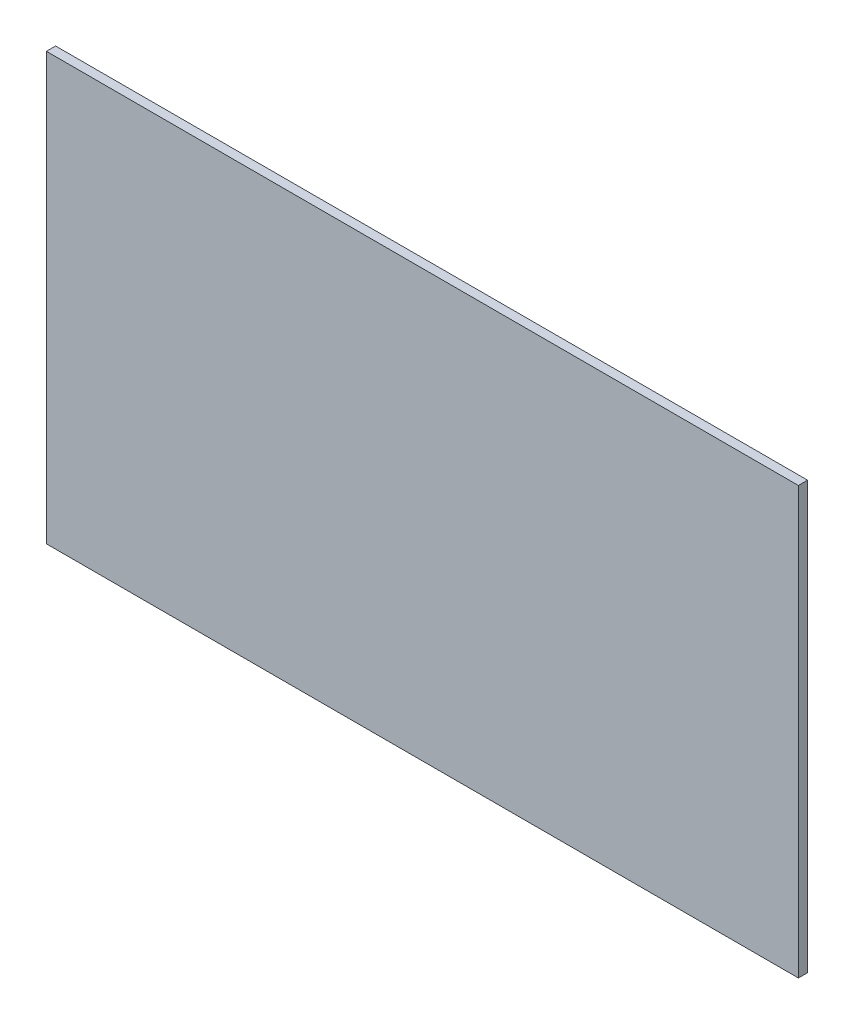
ISO-10303-21;
HEADER;
FILE_DESCRIPTION(('STEP AP214'),'2;1');
FILE_NAME('part.step','',(''),(''),'','','');
FILE_SCHEMA(('AUTOMOTIVE_DESIGN { 1 0 10303 214 1 1 1 1 }'));
ENDSEC;
DATA;
#1=APPLICATION_CONTEXT('core data for automotive mechanical design processes');
#2=APPLICATION_PROTOCOL_DEFINITION('international standard','automotive_design',2000,#1);
#3=PRODUCT_CONTEXT('',#1,'mechanical');
#4=PRODUCT('Part','Part','',(#3));
#5=PRODUCT_RELATED_PRODUCT_CATEGORY('part','',(#4));
#6=PRODUCT_DEFINITION_FORMATION('','',#4);
#7=PRODUCT_DEFINITION_CONTEXT('part definition',#1,'design');
#8=PRODUCT_DEFINITION('design','',#6,#7);
#9=PRODUCT_DEFINITION_SHAPE('','',#8);
#10=(LENGTH_UNIT() NAMED_UNIT(*) SI_UNIT(.MILLI.,.METRE.));
#11=(NAMED_UNIT(*) PLANE_ANGLE_UNIT() SI_UNIT($,.RADIAN.));
#12=(NAMED_UNIT(*) SI_UNIT($,.STERADIAN.) SOLID_ANGLE_UNIT());
#13=UNCERTAINTY_MEASURE_WITH_UNIT(LENGTH_MEASURE(1.E-05),#10,'distance_accuracy_value','');
#14=(GEOMETRIC_REPRESENTATION_CONTEXT(3) GLOBAL_UNCERTAINTY_ASSIGNED_CONTEXT((#13)) GLOBAL_UNIT_ASSIGNED_CONTEXT((#10,
#11,#12)) REPRESENTATION_CONTEXT('',''));
#15=CARTESIAN_POINT('',(0.,0.,0.));
#16=DIRECTION('',(0.,0.,1.));
#17=DIRECTION('',(1.,0.,0.));
#18=AXIS2_PLACEMENT_3D('',#15,#16,#17);
#19=CARTESIAN_POINT('',(0.,0.,25.));
#20=DIRECTION('',(1.,0.,0.));
#21=DIRECTION('',(0.,0.,-1.));
#22=AXIS2_PLACEMENT_3D('',#19,#20,#21);
#23=PLANE('',#22);
#24=DIRECTION('',(0.,-1.,0.));
#25=VECTOR('',#24,1.);
#26=CARTESIAN_POINT('',(0.,0.,0.));
#27=LINE('',#26,#25);
#28=CARTESIAN_POINT('',(0.,1160.,0.));
#29=VERTEX_POINT('',#28);
#30=CARTESIAN_POINT('',(0.,0.,0.));
#31=VERTEX_POINT('',#30);
#32=EDGE_CURVE('E96',#29,#31,#27,.T.);
#33=ORIENTED_EDGE('',*,*,#32,.T.);
#34=DIRECTION('',(0.,0.,-1.));
#35=VECTOR('',#34,1.);
#36=CARTESIAN_POINT('',(0.,0.,25.));
#37=LINE('',#36,#35);
#38=CARTESIAN_POINT('',(0.,0.,25.));
#39=VERTEX_POINT('',#38);
#40=EDGE_CURVE('E11',#39,#31,#37,.T.);
#41=ORIENTED_EDGE('',*,*,#40,.F.);
#42=DIRECTION('',(0.,-1.,0.));
#43=VECTOR('',#42,1.);
#44=CARTESIAN_POINT('',(0.,0.,25.));
#45=LINE('',#44,#43);
#46=CARTESIAN_POINT('',(0.,1160.,25.));
#47=VERTEX_POINT('',#46);
#48=EDGE_CURVE('E84',#47,#39,#45,.T.);
#49=ORIENTED_EDGE('',*,*,#48,.F.);
#50=DIRECTION('',(0.,0.,-1.));
#51=VECTOR('',#50,1.);
#52=CARTESIAN_POINT('',(0.,1160.,25.));
#53=LINE('',#52,#51);
#54=EDGE_CURVE('E92',#47,#29,#53,.T.);
#55=ORIENTED_EDGE('',*,*,#54,.T.);
#56=EDGE_LOOP('',(#33,#41,#49,#55));
#57=FACE_BOUND('',#56,.T.);
#58=ADVANCED_FACE('F33',(#57),#23,.F.);
#59=CARTESIAN_POINT('',(0.,0.,25.));
#60=DIRECTION('',(0.,1.,0.));
#61=DIRECTION('',(0.,0.,1.));
#62=AXIS2_PLACEMENT_3D('',#59,#60,#61);
#63=PLANE('',#62);
#64=DIRECTION('',(1.,0.,0.));
#65=VECTOR('',#64,1.);
#66=CARTESIAN_POINT('',(0.,0.,0.));
#67=LINE('',#66,#65);
#68=CARTESIAN_POINT('',(2045.,0.,0.));
#69=VERTEX_POINT('',#68);
#70=EDGE_CURVE('E88',#31,#69,#67,.T.);
#71=ORIENTED_EDGE('',*,*,#70,.T.);
#72=DIRECTION('',(0.,0.,-1.));
#73=VECTOR('',#72,1.);
#74=CARTESIAN_POINT('',(2045.,0.,25.));
#75=LINE('',#74,#73);
#76=CARTESIAN_POINT('',(2045.,0.,25.));
#77=VERTEX_POINT('',#76);
#78=EDGE_CURVE('E41',#77,#69,#75,.T.);
#79=ORIENTED_EDGE('',*,*,#78,.F.);
#80=DIRECTION('',(1.,0.,0.));
#81=VECTOR('',#80,1.);
#82=CARTESIAN_POINT('',(0.,0.,25.));
#83=LINE('',#82,#81);
#84=EDGE_CURVE('E79',#39,#77,#83,.T.);
#85=ORIENTED_EDGE('',*,*,#84,.F.);
#86=ORIENTED_EDGE('',*,*,#40,.T.);
#87=EDGE_LOOP('',(#71,#79,#85,#86));
#88=FACE_BOUND('',#87,.T.);
#89=ADVANCED_FACE('F87',(#88),#63,.F.);
#90=CARTESIAN_POINT('',(2045.,0.,25.));
#91=DIRECTION('',(-1.,0.,0.));
#92=DIRECTION('',(0.,0.,1.));
#93=AXIS2_PLACEMENT_3D('',#90,#91,#92);
#94=PLANE('',#93);
#95=DIRECTION('',(0.,1.,0.));
#96=VECTOR('',#95,1.);
#97=CARTESIAN_POINT('',(2045.,0.,0.));
#98=LINE('',#97,#96);
#99=CARTESIAN_POINT('',(2045.,1160.,0.));
#100=VERTEX_POINT('',#99);
#101=EDGE_CURVE('E66',#69,#100,#98,.T.);
#102=ORIENTED_EDGE('',*,*,#101,.T.);
#103=DIRECTION('',(0.,0.,-1.));
#104=VECTOR('',#103,1.);
#105=CARTESIAN_POINT('',(2045.,1160.,25.));
#106=LINE('',#105,#104);
#107=CARTESIAN_POINT('',(2045.,1160.,25.));
#108=VERTEX_POINT('',#107);
#109=EDGE_CURVE('E89',#108,#100,#106,.T.);
#110=ORIENTED_EDGE('',*,*,#109,.F.);
#111=DIRECTION('',(0.,1.,0.));
#112=VECTOR('',#111,1.);
#113=CARTESIAN_POINT('',(2045.,0.,25.));
#114=LINE('',#113,#112);
#115=EDGE_CURVE('E82',#77,#108,#114,.T.);
#116=ORIENTED_EDGE('',*,*,#115,.F.);
#117=ORIENTED_EDGE('',*,*,#78,.T.);
#118=EDGE_LOOP('',(#102,#110,#116,#117));
#119=FACE_BOUND('',#118,.T.);
#120=ADVANCED_FACE('F90',(#119),#94,.F.);
#121=CARTESIAN_POINT('',(0.,1160.,25.));
#122=DIRECTION('',(0.,-1.,0.));
#123=DIRECTION('',(0.,0.,-1.));
#124=AXIS2_PLACEMENT_3D('',#121,#122,#123);
#125=PLANE('',#124);
#126=DIRECTION('',(-1.,0.,0.));
#127=VECTOR('',#126,1.);
#128=CARTESIAN_POINT('',(0.,1160.,0.));
#129=LINE('',#128,#127);
#130=EDGE_CURVE('E72',#100,#29,#129,.T.);
#131=ORIENTED_EDGE('',*,*,#130,.T.);
#132=ORIENTED_EDGE('',*,*,#54,.F.);
#133=DIRECTION('',(-1.,0.,0.));
#134=VECTOR('',#133,1.);
#135=CARTESIAN_POINT('',(0.,1160.,25.));
#136=LINE('',#135,#134);
#137=EDGE_CURVE('E49',#108,#47,#136,.T.);
#138=ORIENTED_EDGE('',*,*,#137,.F.);
#139=ORIENTED_EDGE('',*,*,#109,.T.);
#140=EDGE_LOOP('',(#131,#132,#138,#139));
#141=FACE_BOUND('',#140,.T.);
#142=ADVANCED_FACE('F103',(#141),#125,.F.);
#143=CARTESIAN_POINT('',(0.,0.,25.));
#144=DIRECTION('',(0.,0.,-1.));
#145=DIRECTION('',(-1.,0.,0.));
#146=AXIS2_PLACEMENT_3D('',#143,#144,#145);
#147=PLANE('',#146);
#148=ORIENTED_EDGE('',*,*,#48,.T.);
#149=ORIENTED_EDGE('',*,*,#84,.T.);
#150=ORIENTED_EDGE('',*,*,#115,.T.);
#151=ORIENTED_EDGE('',*,*,#137,.T.);
#152=EDGE_LOOP('',(#148,#149,#150,#151));
#153=FACE_BOUND('',#152,.T.);
#154=ADVANCED_FACE('F80',(#153),#147,.F.);
#155=CARTESIAN_POINT('',(0.,0.,0.));
#156=DIRECTION('',(0.,0.,-1.));
#157=DIRECTION('',(-1.,0.,0.));
#158=AXIS2_PLACEMENT_3D('',#155,#156,#157);
#159=PLANE('',#158);
#160=ORIENTED_EDGE('',*,*,#32,.F.);
#161=ORIENTED_EDGE('',*,*,#130,.F.);
#162=ORIENTED_EDGE('',*,*,#101,.F.);
#163=ORIENTED_EDGE('',*,*,#70,.F.);
#164=EDGE_LOOP('',(#160,#161,#162,#163));
#165=FACE_BOUND('',#164,.T.);
#166=ADVANCED_FACE('F106',(#165),#159,.T.);
#167=CLOSED_SHELL('',(#58,#89,#120,#142,#154,#166));
#168=MANIFOLD_SOLID_BREP('B2',#167);
#169=ADVANCED_BREP_SHAPE_REPRESENTATION('',(#18,#168),#14);
#170=SHAPE_DEFINITION_REPRESENTATION(#9,#169);
ENDSEC;
END-ISO-10303-21;
